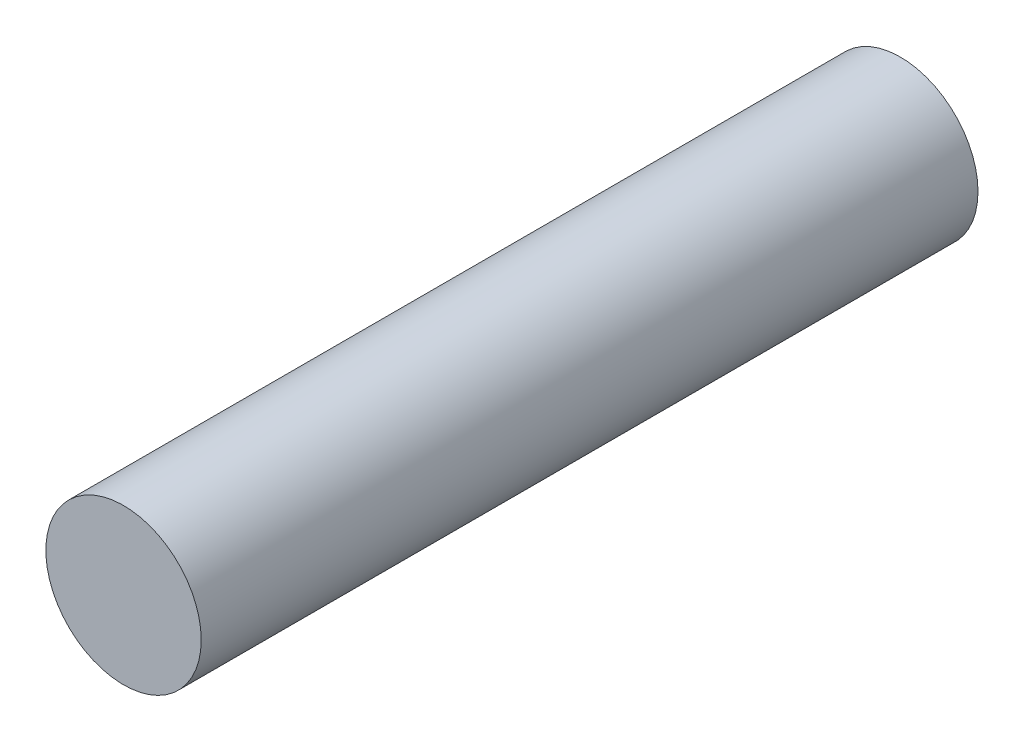
ISO-10303-21;
HEADER;
FILE_DESCRIPTION(('STEP AP214'),'2;1');
FILE_NAME('part.step','',(''),(''),'','','');
FILE_SCHEMA(('AUTOMOTIVE_DESIGN { 1 0 10303 214 1 1 1 1 }'));
ENDSEC;
DATA;
#1=APPLICATION_CONTEXT('core data for automotive mechanical design processes');
#2=APPLICATION_PROTOCOL_DEFINITION('international standard','automotive_design',2000,#1);
#3=PRODUCT_CONTEXT('',#1,'mechanical');
#4=PRODUCT('Part','Part','',(#3));
#5=PRODUCT_RELATED_PRODUCT_CATEGORY('part','',(#4));
#6=PRODUCT_DEFINITION_FORMATION('','',#4);
#7=PRODUCT_DEFINITION_CONTEXT('part definition',#1,'design');
#8=PRODUCT_DEFINITION('design','',#6,#7);
#9=PRODUCT_DEFINITION_SHAPE('','',#8);
#10=(LENGTH_UNIT() NAMED_UNIT(*) SI_UNIT(.MILLI.,.METRE.));
#11=(NAMED_UNIT(*) PLANE_ANGLE_UNIT() SI_UNIT($,.RADIAN.));
#12=(NAMED_UNIT(*) SI_UNIT($,.STERADIAN.) SOLID_ANGLE_UNIT());
#13=UNCERTAINTY_MEASURE_WITH_UNIT(LENGTH_MEASURE(1.E-05),#10,'distance_accuracy_value','');
#14=(GEOMETRIC_REPRESENTATION_CONTEXT(3) GLOBAL_UNCERTAINTY_ASSIGNED_CONTEXT((#13)) GLOBAL_UNIT_ASSIGNED_CONTEXT((#10,
#11,#12)) REPRESENTATION_CONTEXT('',''));
#15=CARTESIAN_POINT('',(0.,0.,0.));
#16=DIRECTION('',(0.,0.,1.));
#17=DIRECTION('',(1.,0.,0.));
#18=AXIS2_PLACEMENT_3D('',#15,#16,#17);
#19=CARTESIAN_POINT('',(0.,0.,150.));
#20=DIRECTION('',(0.,0.,-1.));
#21=DIRECTION('',(-1.,0.,0.));
#22=AXIS2_PLACEMENT_3D('',#19,#20,#21);
#23=CYLINDRICAL_SURFACE('',#22,15.);
#24=CARTESIAN_POINT('',(0.,0.,150.));
#25=DIRECTION('',(0.,0.,1.));
#26=DIRECTION('',(1.,0.,0.));
#27=AXIS2_PLACEMENT_3D('',#24,#25,#26);
#28=CIRCLE('',#27,15.);
#29=CARTESIAN_POINT('',(15.,0.,150.));
#30=VERTEX_POINT('',#29);
#31=EDGE_CURVE('E10',#30,#30,#28,.T.);
#32=ORIENTED_EDGE('',*,*,#31,.F.);
#33=EDGE_LOOP('',(#32));
#34=FACE_BOUND('',#33,.T.);
#35=CARTESIAN_POINT('',(0.,0.,0.));
#36=DIRECTION('',(0.,0.,1.));
#37=DIRECTION('',(1.,0.,0.));
#38=AXIS2_PLACEMENT_3D('',#35,#36,#37);
#39=CIRCLE('',#38,15.);
#40=CARTESIAN_POINT('',(15.,0.,0.));
#41=VERTEX_POINT('',#40);
#42=EDGE_CURVE('E34',#41,#41,#39,.T.);
#43=ORIENTED_EDGE('',*,*,#42,.T.);
#44=EDGE_LOOP('',(#43));
#45=FACE_BOUND('',#44,.T.);
#46=ADVANCED_FACE('F31',(#34,#45),#23,.T.);
#47=CARTESIAN_POINT('',(0.,0.,150.));
#48=DIRECTION('',(0.,0.,1.));
#49=DIRECTION('',(1.,0.,0.));
#50=AXIS2_PLACEMENT_3D('',#47,#48,#49);
#51=PLANE('',#50);
#52=ORIENTED_EDGE('',*,*,#31,.T.);
#53=EDGE_LOOP('',(#52));
#54=FACE_BOUND('',#53,.T.);
#55=ADVANCED_FACE('F46',(#54),#51,.T.);
#56=CARTESIAN_POINT('',(0.,0.,0.));
#57=DIRECTION('',(0.,0.,1.));
#58=DIRECTION('',(1.,0.,0.));
#59=AXIS2_PLACEMENT_3D('',#56,#57,#58);
#60=PLANE('',#59);
#61=ORIENTED_EDGE('',*,*,#42,.F.);
#62=EDGE_LOOP('',(#61));
#63=FACE_BOUND('',#62,.T.);
#64=ADVANCED_FACE('F44',(#63),#60,.F.);
#65=CLOSED_SHELL('',(#46,#55,#64));
#66=MANIFOLD_SOLID_BREP('B2',#65);
#67=ADVANCED_BREP_SHAPE_REPRESENTATION('',(#18,#66),#14);
#68=SHAPE_DEFINITION_REPRESENTATION(#9,#67);
ENDSEC;
END-ISO-10303-21;
